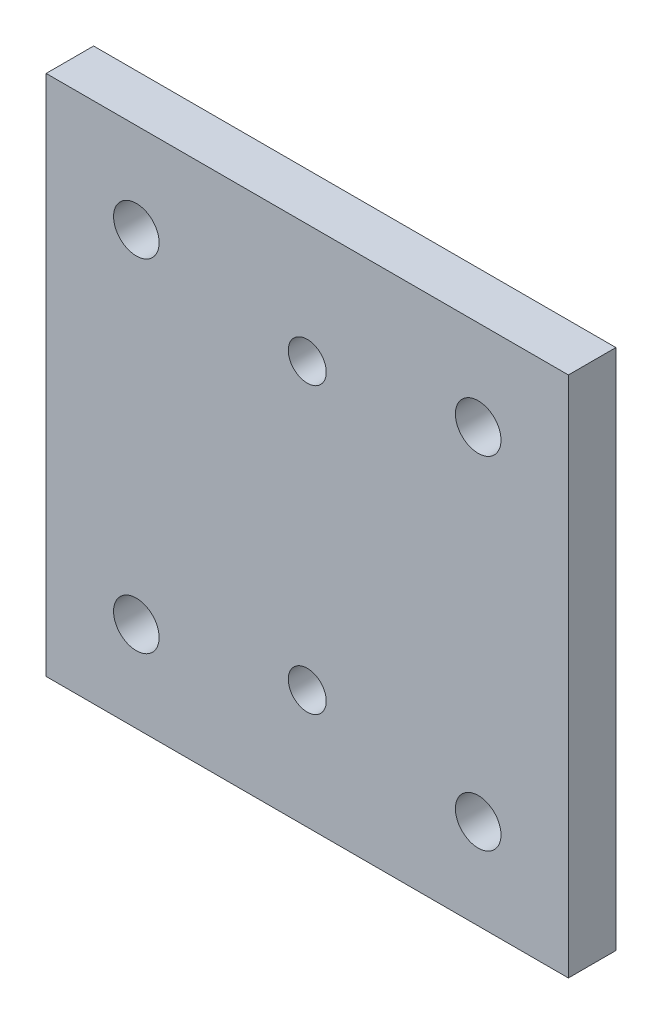
ISO-10303-21;
HEADER;
FILE_DESCRIPTION(('STEP AP214'),'2;1');
FILE_NAME('part.step','',(''),(''),'','','');
FILE_SCHEMA(('AUTOMOTIVE_DESIGN { 1 0 10303 214 1 1 1 1 }'));
ENDSEC;
DATA;
#1=APPLICATION_CONTEXT('core data for automotive mechanical design processes');
#2=APPLICATION_PROTOCOL_DEFINITION('international standard','automotive_design',2000,#1);
#3=PRODUCT_CONTEXT('',#1,'mechanical');
#4=PRODUCT('Part','Part','',(#3));
#5=PRODUCT_RELATED_PRODUCT_CATEGORY('part','',(#4));
#6=PRODUCT_DEFINITION_FORMATION('','',#4);
#7=PRODUCT_DEFINITION_CONTEXT('part definition',#1,'design');
#8=PRODUCT_DEFINITION('design','',#6,#7);
#9=PRODUCT_DEFINITION_SHAPE('','',#8);
#10=(LENGTH_UNIT() NAMED_UNIT(*) SI_UNIT(.MILLI.,.METRE.));
#11=(NAMED_UNIT(*) PLANE_ANGLE_UNIT() SI_UNIT($,.RADIAN.));
#12=(NAMED_UNIT(*) SI_UNIT($,.STERADIAN.) SOLID_ANGLE_UNIT());
#13=UNCERTAINTY_MEASURE_WITH_UNIT(LENGTH_MEASURE(1.E-05),#10,'distance_accuracy_value','');
#14=(GEOMETRIC_REPRESENTATION_CONTEXT(3) GLOBAL_UNCERTAINTY_ASSIGNED_CONTEXT((#13)) GLOBAL_UNIT_ASSIGNED_CONTEXT((#10,
#11,#12)) REPRESENTATION_CONTEXT('',''));
#15=CARTESIAN_POINT('',(0.,0.,0.));
#16=DIRECTION('',(0.,0.,1.));
#17=DIRECTION('',(1.,0.,0.));
#18=AXIS2_PLACEMENT_3D('',#15,#16,#17);
#19=CARTESIAN_POINT('',(-18.,-18.,2.5));
#20=DIRECTION('',(0.,0.,1.));
#21=DIRECTION('',(1.,0.,0.));
#22=AXIS2_PLACEMENT_3D('',#19,#20,#21);
#23=CYLINDRICAL_SURFACE('',#22,2.4);
#24=CARTESIAN_POINT('',(-18.,-18.,2.5));
#25=DIRECTION('',(0.,0.,1.));
#26=DIRECTION('',(1.,0.,0.));
#27=AXIS2_PLACEMENT_3D('',#24,#25,#26);
#28=CIRCLE('',#27,2.4);
#29=CARTESIAN_POINT('',(-15.6,-18.,2.5));
#30=VERTEX_POINT('',#29);
#31=EDGE_CURVE('E41',#30,#30,#28,.T.);
#32=ORIENTED_EDGE('',*,*,#31,.T.);
#33=EDGE_LOOP('',(#32));
#34=FACE_BOUND('',#33,.T.);
#35=CARTESIAN_POINT('',(-18.,-18.,-2.5));
#36=DIRECTION('',(0.,0.,-1.));
#37=DIRECTION('',(-1.,0.,0.));
#38=AXIS2_PLACEMENT_3D('',#35,#36,#37);
#39=CIRCLE('',#38,2.4);
#40=CARTESIAN_POINT('',(-20.4,-18.,-2.5));
#41=VERTEX_POINT('',#40);
#42=EDGE_CURVE('E11',#41,#41,#39,.T.);
#43=ORIENTED_EDGE('',*,*,#42,.T.);
#44=EDGE_LOOP('',(#43));
#45=FACE_BOUND('',#44,.T.);
#46=ADVANCED_FACE('F33',(#34,#45),#23,.F.);
#47=CARTESIAN_POINT('',(18.,-18.,2.5));
#48=DIRECTION('',(0.,0.,1.));
#49=DIRECTION('',(1.,0.,0.));
#50=AXIS2_PLACEMENT_3D('',#47,#48,#49);
#51=CYLINDRICAL_SURFACE('',#50,2.4);
#52=CARTESIAN_POINT('',(18.,-18.,2.5));
#53=DIRECTION('',(0.,0.,1.));
#54=DIRECTION('',(1.,0.,0.));
#55=AXIS2_PLACEMENT_3D('',#52,#53,#54);
#56=CIRCLE('',#55,2.4);
#57=CARTESIAN_POINT('',(20.4,-18.,2.5));
#58=VERTEX_POINT('',#57);
#59=EDGE_CURVE('E111',#58,#58,#56,.T.);
#60=ORIENTED_EDGE('',*,*,#59,.T.);
#61=EDGE_LOOP('',(#60));
#62=FACE_BOUND('',#61,.T.);
#63=CARTESIAN_POINT('',(18.,-18.,-2.5));
#64=DIRECTION('',(0.,0.,-1.));
#65=DIRECTION('',(-1.,0.,0.));
#66=AXIS2_PLACEMENT_3D('',#63,#64,#65);
#67=CIRCLE('',#66,2.4);
#68=CARTESIAN_POINT('',(15.6,-18.,-2.5));
#69=VERTEX_POINT('',#68);
#70=EDGE_CURVE('E114',#69,#69,#67,.T.);
#71=ORIENTED_EDGE('',*,*,#70,.T.);
#72=EDGE_LOOP('',(#71));
#73=FACE_BOUND('',#72,.T.);
#74=ADVANCED_FACE('F138',(#62,#73),#51,.F.);
#75=CARTESIAN_POINT('',(-27.5,27.5,2.5));
#76=DIRECTION('',(1.,0.,0.));
#77=DIRECTION('',(0.,1.,0.));
#78=AXIS2_PLACEMENT_3D('',#75,#76,#77);
#79=PLANE('',#78);
#80=DIRECTION('',(0.,-1.,0.));
#81=VECTOR('',#80,1.);
#82=CARTESIAN_POINT('',(-27.5,27.5,-2.5));
#83=LINE('',#82,#81);
#84=CARTESIAN_POINT('',(-27.5,27.5,-2.5));
#85=VERTEX_POINT('',#84);
#86=CARTESIAN_POINT('',(-27.5,-27.5,-2.5));
#87=VERTEX_POINT('',#86);
#88=EDGE_CURVE('E101',#85,#87,#83,.T.);
#89=ORIENTED_EDGE('',*,*,#88,.T.);
#90=DIRECTION('',(0.,0.,-1.));
#91=VECTOR('',#90,1.);
#92=CARTESIAN_POINT('',(-27.5,-27.5,2.5));
#93=LINE('',#92,#91);
#94=CARTESIAN_POINT('',(-27.5,-27.5,2.5));
#95=VERTEX_POINT('',#94);
#96=EDGE_CURVE('E92',#95,#87,#93,.T.);
#97=ORIENTED_EDGE('',*,*,#96,.F.);
#98=DIRECTION('',(0.,-1.,0.));
#99=VECTOR('',#98,1.);
#100=CARTESIAN_POINT('',(-27.5,27.5,2.5));
#101=LINE('',#100,#99);
#102=CARTESIAN_POINT('',(-27.5,27.5,2.5));
#103=VERTEX_POINT('',#102);
#104=EDGE_CURVE('E86',#103,#95,#101,.T.);
#105=ORIENTED_EDGE('',*,*,#104,.F.);
#106=DIRECTION('',(0.,0.,-1.));
#107=VECTOR('',#106,1.);
#108=CARTESIAN_POINT('',(-27.5,27.5,2.5));
#109=LINE('',#108,#107);
#110=EDGE_CURVE('E97',#103,#85,#109,.T.);
#111=ORIENTED_EDGE('',*,*,#110,.T.);
#112=EDGE_LOOP('',(#89,#97,#105,#111));
#113=FACE_BOUND('',#112,.T.);
#114=ADVANCED_FACE('F142',(#113),#79,.F.);
#115=CARTESIAN_POINT('',(27.5,-27.5,2.5));
#116=DIRECTION('',(0.,1.,0.));
#117=DIRECTION('',(-1.,0.,0.));
#118=AXIS2_PLACEMENT_3D('',#115,#116,#117);
#119=PLANE('',#118);
#120=DIRECTION('',(1.,0.,0.));
#121=VECTOR('',#120,1.);
#122=CARTESIAN_POINT('',(27.5,-27.5,-2.5));
#123=LINE('',#122,#121);
#124=CARTESIAN_POINT('',(27.5,-27.5,-2.5));
#125=VERTEX_POINT('',#124);
#126=EDGE_CURVE('E91',#87,#125,#123,.T.);
#127=ORIENTED_EDGE('',*,*,#126,.T.);
#128=DIRECTION('',(0.,0.,-1.));
#129=VECTOR('',#128,1.);
#130=CARTESIAN_POINT('',(27.5,-27.5,2.5));
#131=LINE('',#130,#129);
#132=CARTESIAN_POINT('',(27.5,-27.5,2.5));
#133=VERTEX_POINT('',#132);
#134=EDGE_CURVE('E89',#133,#125,#131,.T.);
#135=ORIENTED_EDGE('',*,*,#134,.F.);
#136=DIRECTION('',(1.,0.,0.));
#137=VECTOR('',#136,1.);
#138=CARTESIAN_POINT('',(27.5,-27.5,2.5));
#139=LINE('',#138,#137);
#140=EDGE_CURVE('E80',#95,#133,#139,.T.);
#141=ORIENTED_EDGE('',*,*,#140,.F.);
#142=ORIENTED_EDGE('',*,*,#96,.T.);
#143=EDGE_LOOP('',(#127,#135,#141,#142));
#144=FACE_BOUND('',#143,.T.);
#145=ADVANCED_FACE('F90',(#144),#119,.F.);
#146=CARTESIAN_POINT('',(27.5,27.5,2.5));
#147=DIRECTION('',(-1.,0.,0.));
#148=DIRECTION('',(0.,-1.,0.));
#149=AXIS2_PLACEMENT_3D('',#146,#147,#148);
#150=PLANE('',#149);
#151=DIRECTION('',(0.,1.,0.));
#152=VECTOR('',#151,1.);
#153=CARTESIAN_POINT('',(27.5,27.5,-2.5));
#154=LINE('',#153,#152);
#155=CARTESIAN_POINT('',(27.5,27.5,-2.5));
#156=VERTEX_POINT('',#155);
#157=EDGE_CURVE('E66',#125,#156,#154,.T.);
#158=ORIENTED_EDGE('',*,*,#157,.T.);
#159=DIRECTION('',(0.,0.,-1.));
#160=VECTOR('',#159,1.);
#161=CARTESIAN_POINT('',(27.5,27.5,2.5));
#162=LINE('',#161,#160);
#163=CARTESIAN_POINT('',(27.5,27.5,2.5));
#164=VERTEX_POINT('',#163);
#165=EDGE_CURVE('E93',#164,#156,#162,.T.);
#166=ORIENTED_EDGE('',*,*,#165,.F.);
#167=DIRECTION('',(0.,1.,0.));
#168=VECTOR('',#167,1.);
#169=CARTESIAN_POINT('',(27.5,27.5,2.5));
#170=LINE('',#169,#168);
#171=EDGE_CURVE('E84',#133,#164,#170,.T.);
#172=ORIENTED_EDGE('',*,*,#171,.F.);
#173=ORIENTED_EDGE('',*,*,#134,.T.);
#174=EDGE_LOOP('',(#158,#166,#172,#173));
#175=FACE_BOUND('',#174,.T.);
#176=ADVANCED_FACE('F95',(#175),#150,.F.);
#177=CARTESIAN_POINT('',(27.5,27.5,2.5));
#178=DIRECTION('',(0.,-1.,0.));
#179=DIRECTION('',(1.,0.,0.));
#180=AXIS2_PLACEMENT_3D('',#177,#178,#179);
#181=PLANE('',#180);
#182=DIRECTION('',(-1.,0.,0.));
#183=VECTOR('',#182,1.);
#184=CARTESIAN_POINT('',(27.5,27.5,-2.5));
#185=LINE('',#184,#183);
#186=EDGE_CURVE('E72',#156,#85,#185,.T.);
#187=ORIENTED_EDGE('',*,*,#186,.T.);
#188=ORIENTED_EDGE('',*,*,#110,.F.);
#189=DIRECTION('',(-1.,0.,0.));
#190=VECTOR('',#189,1.);
#191=CARTESIAN_POINT('',(27.5,27.5,2.5));
#192=LINE('',#191,#190);
#193=EDGE_CURVE('E49',#164,#103,#192,.T.);
#194=ORIENTED_EDGE('',*,*,#193,.F.);
#195=ORIENTED_EDGE('',*,*,#165,.T.);
#196=EDGE_LOOP('',(#187,#188,#194,#195));
#197=FACE_BOUND('',#196,.T.);
#198=ADVANCED_FACE('F123',(#197),#181,.F.);
#199=CARTESIAN_POINT('',(0.,0.,2.5));
#200=DIRECTION('',(0.,0.,-1.));
#201=DIRECTION('',(-1.,0.,0.));
#202=AXIS2_PLACEMENT_3D('',#199,#200,#201);
#203=PLANE('',#202);
#204=CARTESIAN_POINT('',(0.,-15.,2.5));
#205=DIRECTION('',(0.,0.,1.));
#206=DIRECTION('',(1.,0.,0.));
#207=AXIS2_PLACEMENT_3D('',#204,#205,#206);
#208=CIRCLE('',#207,2.);
#209=CARTESIAN_POINT('',(2.,-15.,2.5));
#210=VERTEX_POINT('',#209);
#211=EDGE_CURVE('E227',#210,#210,#208,.T.);
#212=ORIENTED_EDGE('',*,*,#211,.F.);
#213=EDGE_LOOP('',(#212));
#214=FACE_BOUND('',#213,.T.);
#215=CARTESIAN_POINT('',(0.,15.,2.5));
#216=DIRECTION('',(0.,0.,1.));
#217=DIRECTION('',(1.,0.,0.));
#218=AXIS2_PLACEMENT_3D('',#215,#216,#217);
#219=CIRCLE('',#218,2.);
#220=CARTESIAN_POINT('',(2.,15.,2.5));
#221=VERTEX_POINT('',#220);
#222=EDGE_CURVE('E229',#221,#221,#219,.T.);
#223=ORIENTED_EDGE('',*,*,#222,.F.);
#224=EDGE_LOOP('',(#223));
#225=FACE_BOUND('',#224,.T.);
#226=CARTESIAN_POINT('',(-18.,18.,2.5));
#227=DIRECTION('',(0.,0.,1.));
#228=DIRECTION('',(1.,0.,0.));
#229=AXIS2_PLACEMENT_3D('',#226,#227,#228);
#230=CIRCLE('',#229,2.4);
#231=CARTESIAN_POINT('',(-15.6,18.,2.5));
#232=VERTEX_POINT('',#231);
#233=EDGE_CURVE('E235',#232,#232,#230,.T.);
#234=ORIENTED_EDGE('',*,*,#233,.F.);
#235=EDGE_LOOP('',(#234));
#236=FACE_BOUND('',#235,.T.);
#237=CARTESIAN_POINT('',(18.,18.,2.5));
#238=DIRECTION('',(0.,0.,1.));
#239=DIRECTION('',(1.,0.,0.));
#240=AXIS2_PLACEMENT_3D('',#237,#238,#239);
#241=CIRCLE('',#240,2.4);
#242=CARTESIAN_POINT('',(20.4,18.,2.5));
#243=VERTEX_POINT('',#242);
#244=EDGE_CURVE('E243',#243,#243,#241,.T.);
#245=ORIENTED_EDGE('',*,*,#244,.F.);
#246=EDGE_LOOP('',(#245));
#247=FACE_BOUND('',#246,.T.);
#248=ORIENTED_EDGE('',*,*,#104,.T.);
#249=ORIENTED_EDGE('',*,*,#140,.T.);
#250=ORIENTED_EDGE('',*,*,#171,.T.);
#251=ORIENTED_EDGE('',*,*,#193,.T.);
#252=EDGE_LOOP('',(#248,#249,#250,#251));
#253=FACE_BOUND('',#252,.T.);
#254=ORIENTED_EDGE('',*,*,#59,.F.);
#255=EDGE_LOOP('',(#254));
#256=FACE_BOUND('',#255,.T.);
#257=ORIENTED_EDGE('',*,*,#31,.F.);
#258=EDGE_LOOP('',(#257));
#259=FACE_BOUND('',#258,.T.);
#260=ADVANCED_FACE('F81',(#214,#225,#236,#247,#253,#256,#259),#203,.F.);
#261=CARTESIAN_POINT('',(0.,0.,-2.5));
#262=DIRECTION('',(0.,0.,-1.));
#263=DIRECTION('',(-1.,0.,0.));
#264=AXIS2_PLACEMENT_3D('',#261,#262,#263);
#265=PLANE('',#264);
#266=CARTESIAN_POINT('',(0.,-15.,-2.5));
#267=DIRECTION('',(0.,0.,1.));
#268=DIRECTION('',(1.,0.,0.));
#269=AXIS2_PLACEMENT_3D('',#266,#267,#268);
#270=CIRCLE('',#269,2.);
#271=CARTESIAN_POINT('',(2.,-15.,-2.5));
#272=VERTEX_POINT('',#271);
#273=EDGE_CURVE('E225',#272,#272,#270,.T.);
#274=ORIENTED_EDGE('',*,*,#273,.T.);
#275=EDGE_LOOP('',(#274));
#276=FACE_BOUND('',#275,.T.);
#277=CARTESIAN_POINT('',(0.,15.,-2.5));
#278=DIRECTION('',(0.,0.,1.));
#279=DIRECTION('',(1.,0.,0.));
#280=AXIS2_PLACEMENT_3D('',#277,#278,#279);
#281=CIRCLE('',#280,2.);
#282=CARTESIAN_POINT('',(2.,15.,-2.5));
#283=VERTEX_POINT('',#282);
#284=EDGE_CURVE('E232',#283,#283,#281,.T.);
#285=ORIENTED_EDGE('',*,*,#284,.T.);
#286=EDGE_LOOP('',(#285));
#287=FACE_BOUND('',#286,.T.);
#288=CARTESIAN_POINT('',(-18.,18.,-2.5));
#289=DIRECTION('',(0.,0.,-1.));
#290=DIRECTION('',(-1.,0.,0.));
#291=AXIS2_PLACEMENT_3D('',#288,#289,#290);
#292=CIRCLE('',#291,2.4);
#293=CARTESIAN_POINT('',(-20.4,18.,-2.5));
#294=VERTEX_POINT('',#293);
#295=EDGE_CURVE('E240',#294,#294,#292,.T.);
#296=ORIENTED_EDGE('',*,*,#295,.F.);
#297=EDGE_LOOP('',(#296));
#298=FACE_BOUND('',#297,.T.);
#299=CARTESIAN_POINT('',(18.,18.,-2.5));
#300=DIRECTION('',(0.,0.,-1.));
#301=DIRECTION('',(-1.,0.,0.));
#302=AXIS2_PLACEMENT_3D('',#299,#300,#301);
#303=CIRCLE('',#302,2.4);
#304=CARTESIAN_POINT('',(15.6,18.,-2.5));
#305=VERTEX_POINT('',#304);
#306=EDGE_CURVE('E104',#305,#305,#303,.T.);
#307=ORIENTED_EDGE('',*,*,#306,.F.);
#308=EDGE_LOOP('',(#307));
#309=FACE_BOUND('',#308,.T.);
#310=ORIENTED_EDGE('',*,*,#88,.F.);
#311=ORIENTED_EDGE('',*,*,#186,.F.);
#312=ORIENTED_EDGE('',*,*,#157,.F.);
#313=ORIENTED_EDGE('',*,*,#126,.F.);
#314=EDGE_LOOP('',(#310,#311,#312,#313));
#315=FACE_BOUND('',#314,.T.);
#316=ORIENTED_EDGE('',*,*,#70,.F.);
#317=EDGE_LOOP('',(#316));
#318=FACE_BOUND('',#317,.T.);
#319=ORIENTED_EDGE('',*,*,#42,.F.);
#320=EDGE_LOOP('',(#319));
#321=FACE_BOUND('',#320,.T.);
#322=ADVANCED_FACE('F122',(#276,#287,#298,#309,#315,#318,#321),#265,.T.);
#323=CARTESIAN_POINT('',(18.,18.,2.5));
#324=DIRECTION('',(0.,0.,1.));
#325=DIRECTION('',(1.,0.,0.));
#326=AXIS2_PLACEMENT_3D('',#323,#324,#325);
#327=CYLINDRICAL_SURFACE('',#326,2.4);
#328=ORIENTED_EDGE('',*,*,#244,.T.);
#329=EDGE_LOOP('',(#328));
#330=FACE_BOUND('',#329,.T.);
#331=ORIENTED_EDGE('',*,*,#306,.T.);
#332=EDGE_LOOP('',(#331));
#333=FACE_BOUND('',#332,.T.);
#334=ADVANCED_FACE('F130',(#330,#333),#327,.F.);
#335=CARTESIAN_POINT('',(-18.,18.,2.5));
#336=DIRECTION('',(0.,0.,1.));
#337=DIRECTION('',(1.,0.,0.));
#338=AXIS2_PLACEMENT_3D('',#335,#336,#337);
#339=CYLINDRICAL_SURFACE('',#338,2.4);
#340=ORIENTED_EDGE('',*,*,#233,.T.);
#341=EDGE_LOOP('',(#340));
#342=FACE_BOUND('',#341,.T.);
#343=ORIENTED_EDGE('',*,*,#295,.T.);
#344=EDGE_LOOP('',(#343));
#345=FACE_BOUND('',#344,.T.);
#346=ADVANCED_FACE('F171',(#342,#345),#339,.F.);
#347=CARTESIAN_POINT('',(0.,15.,-2.5));
#348=DIRECTION('',(0.,0.,1.));
#349=DIRECTION('',(1.,0.,0.));
#350=AXIS2_PLACEMENT_3D('',#347,#348,#349);
#351=CYLINDRICAL_SURFACE('',#350,2.);
#352=ORIENTED_EDGE('',*,*,#284,.F.);
#353=EDGE_LOOP('',(#352));
#354=FACE_BOUND('',#353,.T.);
#355=ORIENTED_EDGE('',*,*,#222,.T.);
#356=EDGE_LOOP('',(#355));
#357=FACE_BOUND('',#356,.T.);
#358=ADVANCED_FACE('F189',(#354,#357),#351,.F.);
#359=CARTESIAN_POINT('',(0.,-15.,-2.5));
#360=DIRECTION('',(0.,0.,1.));
#361=DIRECTION('',(1.,0.,0.));
#362=AXIS2_PLACEMENT_3D('',#359,#360,#361);
#363=CYLINDRICAL_SURFACE('',#362,2.);
#364=ORIENTED_EDGE('',*,*,#273,.F.);
#365=EDGE_LOOP('',(#364));
#366=FACE_BOUND('',#365,.T.);
#367=ORIENTED_EDGE('',*,*,#211,.T.);
#368=EDGE_LOOP('',(#367));
#369=FACE_BOUND('',#368,.T.);
#370=ADVANCED_FACE('F208',(#366,#369),#363,.F.);
#371=CLOSED_SHELL('',(#46,#74,#114,#145,#176,#198,#260,#322,#334,#346,#358,#370));
#372=MANIFOLD_SOLID_BREP('B2',#371);
#373=ADVANCED_BREP_SHAPE_REPRESENTATION('',(#18,#372),#14);
#374=SHAPE_DEFINITION_REPRESENTATION(#9,#373);
ENDSEC;
END-ISO-10303-21;
